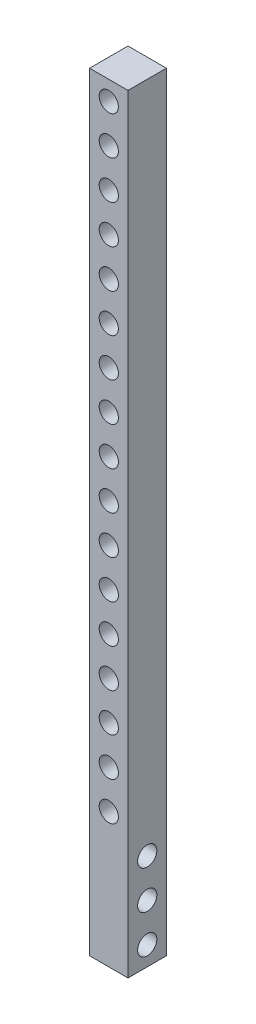
ISO-10303-21;
HEADER;
FILE_DESCRIPTION(('STEP AP214'),'2;1');
FILE_NAME('part.step','',(''),(''),'','','');
FILE_SCHEMA(('AUTOMOTIVE_DESIGN { 1 0 10303 214 1 1 1 1 }'));
ENDSEC;
DATA;
#1=APPLICATION_CONTEXT('core data for automotive mechanical design processes');
#2=APPLICATION_PROTOCOL_DEFINITION('international standard','automotive_design',2000,#1);
#3=PRODUCT_CONTEXT('',#1,'mechanical');
#4=PRODUCT('Part','Part','',(#3));
#5=PRODUCT_RELATED_PRODUCT_CATEGORY('part','',(#4));
#6=PRODUCT_DEFINITION_FORMATION('','',#4);
#7=PRODUCT_DEFINITION_CONTEXT('part definition',#1,'design');
#8=PRODUCT_DEFINITION('design','',#6,#7);
#9=PRODUCT_DEFINITION_SHAPE('','',#8);
#10=(LENGTH_UNIT() NAMED_UNIT(*) SI_UNIT(.MILLI.,.METRE.));
#11=(NAMED_UNIT(*) PLANE_ANGLE_UNIT() SI_UNIT($,.RADIAN.));
#12=(NAMED_UNIT(*) SI_UNIT($,.STERADIAN.) SOLID_ANGLE_UNIT());
#13=UNCERTAINTY_MEASURE_WITH_UNIT(LENGTH_MEASURE(1.E-05),#10,'distance_accuracy_value','');
#14=(GEOMETRIC_REPRESENTATION_CONTEXT(3) GLOBAL_UNCERTAINTY_ASSIGNED_CONTEXT((#13)) GLOBAL_UNIT_ASSIGNED_CONTEXT((#10,
#11,#12)) REPRESENTATION_CONTEXT('',''));
#15=CARTESIAN_POINT('',(0.,0.,0.));
#16=DIRECTION('',(0.,0.,1.));
#17=DIRECTION('',(1.,0.,0.));
#18=AXIS2_PLACEMENT_3D('',#15,#16,#17);
#19=CARTESIAN_POINT('',(0.,0.,10.));
#20=DIRECTION('',(0.,0.,-1.));
#21=DIRECTION('',(-1.,0.,0.));
#22=AXIS2_PLACEMENT_3D('',#19,#20,#21);
#23=PLANE('',#22);
#24=CARTESIAN_POINT('',(1.5720339642174E-12,-55.,10.));
#25=DIRECTION('',(0.,0.,1.));
#26=DIRECTION('',(1.,0.,0.));
#27=AXIS2_PLACEMENT_3D('',#24,#25,#26);
#28=CIRCLE('',#27,2.5);
#29=CARTESIAN_POINT('',(2.50000000000157,-55.,10.));
#30=VERTEX_POINT('',#29);
#31=EDGE_CURVE('E199',#30,#30,#28,.T.);
#32=ORIENTED_EDGE('',*,*,#31,.F.);
#33=EDGE_LOOP('',(#32));
#34=FACE_BOUND('',#33,.T.);
#35=CARTESIAN_POINT('',(1.36254508388681E-12,-35.,10.));
#36=DIRECTION('',(0.,0.,1.));
#37=DIRECTION('',(1.,0.,0.));
#38=AXIS2_PLACEMENT_3D('',#35,#36,#37);
#39=CIRCLE('',#38,2.5);
#40=CARTESIAN_POINT('',(2.50000000000136,-35.,10.));
#41=VERTEX_POINT('',#40);
#42=EDGE_CURVE('E187',#41,#41,#39,.T.);
#43=ORIENTED_EDGE('',*,*,#42,.F.);
#44=EDGE_LOOP('',(#43));
#45=FACE_BOUND('',#44,.T.);
#46=CARTESIAN_POINT('',(1.15305620355622E-12,-15.,10.));
#47=DIRECTION('',(0.,0.,1.));
#48=DIRECTION('',(1.,0.,0.));
#49=AXIS2_PLACEMENT_3D('',#46,#47,#48);
#50=CIRCLE('',#49,2.5);
#51=CARTESIAN_POINT('',(2.50000000000115,-15.,10.));
#52=VERTEX_POINT('',#51);
#53=EDGE_CURVE('E175',#52,#52,#50,.T.);
#54=ORIENTED_EDGE('',*,*,#53,.F.);
#55=EDGE_LOOP('',(#54));
#56=FACE_BOUND('',#55,.T.);
#57=CARTESIAN_POINT('',(9.43567323225634E-13,4.99999999999996,10.));
#58=DIRECTION('',(0.,0.,1.));
#59=DIRECTION('',(1.,0.,0.));
#60=AXIS2_PLACEMENT_3D('',#57,#58,#59);
#61=CIRCLE('',#60,2.5);
#62=CARTESIAN_POINT('',(2.50000000000094,4.99999999999996,10.));
#63=VERTEX_POINT('',#62);
#64=EDGE_CURVE('E163',#63,#63,#61,.T.);
#65=ORIENTED_EDGE('',*,*,#64,.F.);
#66=EDGE_LOOP('',(#65));
#67=FACE_BOUND('',#66,.T.);
#68=CARTESIAN_POINT('',(7.34078442895046E-13,25.,10.));
#69=DIRECTION('',(0.,0.,1.));
#70=DIRECTION('',(1.,0.,0.));
#71=AXIS2_PLACEMENT_3D('',#68,#69,#70);
#72=CIRCLE('',#71,2.5);
#73=CARTESIAN_POINT('',(2.50000000000073,25.,10.));
#74=VERTEX_POINT('',#73);
#75=EDGE_CURVE('E151',#74,#74,#72,.T.);
#76=ORIENTED_EDGE('',*,*,#75,.F.);
#77=EDGE_LOOP('',(#76));
#78=FACE_BOUND('',#77,.T.);
#79=CARTESIAN_POINT('',(5.24589562564458E-13,45.,10.));
#80=DIRECTION('',(0.,0.,1.));
#81=DIRECTION('',(1.,0.,0.));
#82=AXIS2_PLACEMENT_3D('',#79,#80,#81);
#83=CIRCLE('',#82,2.5);
#84=CARTESIAN_POINT('',(2.50000000000053,45.,10.));
#85=VERTEX_POINT('',#84);
#86=EDGE_CURVE('E139',#85,#85,#83,.T.);
#87=ORIENTED_EDGE('',*,*,#86,.F.);
#88=EDGE_LOOP('',(#87));
#89=FACE_BOUND('',#88,.T.);
#90=CARTESIAN_POINT('',(3.1510068223387E-13,65.,10.));
#91=DIRECTION('',(0.,0.,1.));
#92=DIRECTION('',(1.,0.,0.));
#93=AXIS2_PLACEMENT_3D('',#90,#91,#92);
#94=CIRCLE('',#93,2.5);
#95=CARTESIAN_POINT('',(2.50000000000032,65.,10.));
#96=VERTEX_POINT('',#95);
#97=EDGE_CURVE('E127',#96,#96,#94,.T.);
#98=ORIENTED_EDGE('',*,*,#97,.F.);
#99=EDGE_LOOP('',(#98));
#100=FACE_BOUND('',#99,.T.);
#101=CARTESIAN_POINT('',(1.05611801903282E-13,85.,10.));
#102=DIRECTION('',(0.,0.,1.));
#103=DIRECTION('',(1.,0.,0.));
#104=AXIS2_PLACEMENT_3D('',#101,#102,#103);
#105=CIRCLE('',#104,2.5);
#106=CARTESIAN_POINT('',(2.50000000000011,85.,10.));
#107=VERTEX_POINT('',#106);
#108=EDGE_CURVE('E115',#107,#107,#105,.T.);
#109=ORIENTED_EDGE('',*,*,#108,.F.);
#110=EDGE_LOOP('',(#109));
#111=FACE_BOUND('',#110,.T.);
#112=DIRECTION('',(0.,-1.,0.));
#113=VECTOR('',#112,1.);
#114=CARTESIAN_POINT('',(-5.00000000000001,100.,10.));
#115=LINE('',#114,#113);
#116=CARTESIAN_POINT('',(-5.00000000000001,100.,10.));
#117=VERTEX_POINT('',#116);
#118=CARTESIAN_POINT('',(-4.99999999999998,-100.,10.));
#119=VERTEX_POINT('',#118);
#120=EDGE_CURVE('E85',#117,#119,#115,.T.);
#121=ORIENTED_EDGE('',*,*,#120,.T.);
#122=DIRECTION('',(1.,0.,0.));
#123=VECTOR('',#122,1.);
#124=CARTESIAN_POINT('',(5.00000000000001,-100.,10.));
#125=LINE('',#124,#123);
#126=CARTESIAN_POINT('',(5.00000000000001,-100.,10.));
#127=VERTEX_POINT('',#126);
#128=EDGE_CURVE('E80',#119,#127,#125,.T.);
#129=ORIENTED_EDGE('',*,*,#128,.T.);
#130=DIRECTION('',(0.,1.,0.));
#131=VECTOR('',#130,1.);
#132=CARTESIAN_POINT('',(4.99999999999998,99.9999999999999,10.));
#133=LINE('',#132,#131);
#134=CARTESIAN_POINT('',(4.99999999999998,99.9999999999999,10.));
#135=VERTEX_POINT('',#134);
#136=EDGE_CURVE('E83',#127,#135,#133,.T.);
#137=ORIENTED_EDGE('',*,*,#136,.T.);
#138=DIRECTION('',(-1.,0.,0.));
#139=VECTOR('',#138,1.);
#140=CARTESIAN_POINT('',(4.99999999999998,99.9999999999999,10.));
#141=LINE('',#140,#139);
#142=EDGE_CURVE('E50',#135,#117,#141,.T.);
#143=ORIENTED_EDGE('',*,*,#142,.T.);
#144=EDGE_LOOP('',(#121,#129,#137,#143));
#145=FACE_BOUND('',#144,.T.);
#146=CARTESIAN_POINT('',(0.,95.,10.));
#147=DIRECTION('',(0.,0.,1.));
#148=DIRECTION('',(1.,0.,0.));
#149=AXIS2_PLACEMENT_3D('',#146,#147,#148);
#150=CIRCLE('',#149,2.5);
#151=CARTESIAN_POINT('',(2.5,95.,10.));
#152=VERTEX_POINT('',#151);
#153=EDGE_CURVE('E100',#152,#152,#150,.T.);
#154=ORIENTED_EDGE('',*,*,#153,.F.);
#155=EDGE_LOOP('',(#154));
#156=FACE_BOUND('',#155,.T.);
#157=CARTESIAN_POINT('',(2.10356242068576E-13,75.,10.));
#158=DIRECTION('',(0.,0.,1.));
#159=DIRECTION('',(1.,0.,0.));
#160=AXIS2_PLACEMENT_3D('',#157,#158,#159);
#161=CIRCLE('',#160,2.5);
#162=CARTESIAN_POINT('',(2.50000000000021,75.,10.));
#163=VERTEX_POINT('',#162);
#164=EDGE_CURVE('E121',#163,#163,#161,.T.);
#165=ORIENTED_EDGE('',*,*,#164,.F.);
#166=EDGE_LOOP('',(#165));
#167=FACE_BOUND('',#166,.T.);
#168=CARTESIAN_POINT('',(4.19845122399164E-13,55.,10.));
#169=DIRECTION('',(0.,0.,1.));
#170=DIRECTION('',(1.,0.,0.));
#171=AXIS2_PLACEMENT_3D('',#168,#169,#170);
#172=CIRCLE('',#171,2.5);
#173=CARTESIAN_POINT('',(2.50000000000042,55.,10.));
#174=VERTEX_POINT('',#173);
#175=EDGE_CURVE('E133',#174,#174,#172,.T.);
#176=ORIENTED_EDGE('',*,*,#175,.F.);
#177=EDGE_LOOP('',(#176));
#178=FACE_BOUND('',#177,.T.);
#179=CARTESIAN_POINT('',(6.29334002729752E-13,35.,10.));
#180=DIRECTION('',(0.,0.,1.));
#181=DIRECTION('',(1.,0.,0.));
#182=AXIS2_PLACEMENT_3D('',#179,#180,#181);
#183=CIRCLE('',#182,2.5);
#184=CARTESIAN_POINT('',(2.50000000000063,35.,10.));
#185=VERTEX_POINT('',#184);
#186=EDGE_CURVE('E145',#185,#185,#183,.T.);
#187=ORIENTED_EDGE('',*,*,#186,.F.);
#188=EDGE_LOOP('',(#187));
#189=FACE_BOUND('',#188,.T.);
#190=CARTESIAN_POINT('',(8.3882288306034E-13,15.,10.));
#191=DIRECTION('',(0.,0.,1.));
#192=DIRECTION('',(1.,0.,0.));
#193=AXIS2_PLACEMENT_3D('',#190,#191,#192);
#194=CIRCLE('',#193,2.5);
#195=CARTESIAN_POINT('',(2.50000000000084,15.,10.));
#196=VERTEX_POINT('',#195);
#197=EDGE_CURVE('E157',#196,#196,#194,.T.);
#198=ORIENTED_EDGE('',*,*,#197,.F.);
#199=EDGE_LOOP('',(#198));
#200=FACE_BOUND('',#199,.T.);
#201=CARTESIAN_POINT('',(1.04831176339093E-12,-5.00000000000005,10.));
#202=DIRECTION('',(0.,0.,1.));
#203=DIRECTION('',(1.,0.,0.));
#204=AXIS2_PLACEMENT_3D('',#201,#202,#203);
#205=CIRCLE('',#204,2.5);
#206=CARTESIAN_POINT('',(2.50000000000105,-5.00000000000005,10.));
#207=VERTEX_POINT('',#206);
#208=EDGE_CURVE('E169',#207,#207,#205,.T.);
#209=ORIENTED_EDGE('',*,*,#208,.F.);
#210=EDGE_LOOP('',(#209));
#211=FACE_BOUND('',#210,.T.);
#212=CARTESIAN_POINT('',(1.25780064372152E-12,-25.,10.));
#213=DIRECTION('',(0.,0.,1.));
#214=DIRECTION('',(1.,0.,0.));
#215=AXIS2_PLACEMENT_3D('',#212,#213,#214);
#216=CIRCLE('',#215,2.5);
#217=CARTESIAN_POINT('',(2.50000000000126,-25.,10.));
#218=VERTEX_POINT('',#217);
#219=EDGE_CURVE('E181',#218,#218,#216,.T.);
#220=ORIENTED_EDGE('',*,*,#219,.F.);
#221=EDGE_LOOP('',(#220));
#222=FACE_BOUND('',#221,.T.);
#223=CARTESIAN_POINT('',(1.4672895240521E-12,-45.0000000000001,10.));
#224=DIRECTION('',(0.,0.,1.));
#225=DIRECTION('',(1.,0.,0.));
#226=AXIS2_PLACEMENT_3D('',#223,#224,#225);
#227=CIRCLE('',#226,2.5);
#228=CARTESIAN_POINT('',(2.50000000000147,-45.0000000000001,10.));
#229=VERTEX_POINT('',#228);
#230=EDGE_CURVE('E193',#229,#229,#227,.T.);
#231=ORIENTED_EDGE('',*,*,#230,.F.);
#232=EDGE_LOOP('',(#231));
#233=FACE_BOUND('',#232,.T.);
#234=CARTESIAN_POINT('',(1.67677840438269E-12,-65.,10.));
#235=DIRECTION('',(0.,0.,1.));
#236=DIRECTION('',(1.,0.,0.));
#237=AXIS2_PLACEMENT_3D('',#234,#235,#236);
#238=CIRCLE('',#237,2.5);
#239=CARTESIAN_POINT('',(2.50000000000168,-65.,10.));
#240=VERTEX_POINT('',#239);
#241=EDGE_CURVE('E205',#240,#240,#238,.T.);
#242=ORIENTED_EDGE('',*,*,#241,.F.);
#243=EDGE_LOOP('',(#242));
#244=FACE_BOUND('',#243,.T.);
#245=ADVANCED_FACE('F33',(#34,#45,#56,#67,#78,#89,#100,#111,#145,#156,#167,#178,#189,#200,#211,
#222,#233,#244),#23,.F.);
#246=CARTESIAN_POINT('',(0.,0.,0.));
#247=DIRECTION('',(0.,0.,-1.));
#248=DIRECTION('',(-1.,0.,0.));
#249=AXIS2_PLACEMENT_3D('',#246,#247,#248);
#250=PLANE('',#249);
#251=CARTESIAN_POINT('',(1.5720339642174E-12,-55.,0.));
#252=DIRECTION('',(0.,0.,1.));
#253=DIRECTION('',(1.,0.,0.));
#254=AXIS2_PLACEMENT_3D('',#251,#252,#253);
#255=CIRCLE('',#254,2.5);
#256=CARTESIAN_POINT('',(2.50000000000157,-55.,0.));
#257=VERTEX_POINT('',#256);
#258=EDGE_CURVE('E202',#257,#257,#255,.T.);
#259=ORIENTED_EDGE('',*,*,#258,.T.);
#260=EDGE_LOOP('',(#259));
#261=FACE_BOUND('',#260,.T.);
#262=CARTESIAN_POINT('',(1.36254508388681E-12,-35.,0.));
#263=DIRECTION('',(0.,0.,1.));
#264=DIRECTION('',(1.,0.,0.));
#265=AXIS2_PLACEMENT_3D('',#262,#263,#264);
#266=CIRCLE('',#265,2.5);
#267=CARTESIAN_POINT('',(2.50000000000136,-35.,0.));
#268=VERTEX_POINT('',#267);
#269=EDGE_CURVE('E190',#268,#268,#266,.T.);
#270=ORIENTED_EDGE('',*,*,#269,.T.);
#271=EDGE_LOOP('',(#270));
#272=FACE_BOUND('',#271,.T.);
#273=CARTESIAN_POINT('',(1.15305620355622E-12,-15.,0.));
#274=DIRECTION('',(0.,0.,1.));
#275=DIRECTION('',(1.,0.,0.));
#276=AXIS2_PLACEMENT_3D('',#273,#274,#275);
#277=CIRCLE('',#276,2.5);
#278=CARTESIAN_POINT('',(2.50000000000115,-15.,0.));
#279=VERTEX_POINT('',#278);
#280=EDGE_CURVE('E178',#279,#279,#277,.T.);
#281=ORIENTED_EDGE('',*,*,#280,.T.);
#282=EDGE_LOOP('',(#281));
#283=FACE_BOUND('',#282,.T.);
#284=CARTESIAN_POINT('',(9.43567323225634E-13,4.99999999999996,0.));
#285=DIRECTION('',(0.,0.,1.));
#286=DIRECTION('',(1.,0.,0.));
#287=AXIS2_PLACEMENT_3D('',#284,#285,#286);
#288=CIRCLE('',#287,2.5);
#289=CARTESIAN_POINT('',(2.50000000000094,4.99999999999996,0.));
#290=VERTEX_POINT('',#289);
#291=EDGE_CURVE('E166',#290,#290,#288,.T.);
#292=ORIENTED_EDGE('',*,*,#291,.T.);
#293=EDGE_LOOP('',(#292));
#294=FACE_BOUND('',#293,.T.);
#295=CARTESIAN_POINT('',(7.34078442895046E-13,25.,0.));
#296=DIRECTION('',(0.,0.,1.));
#297=DIRECTION('',(1.,0.,0.));
#298=AXIS2_PLACEMENT_3D('',#295,#296,#297);
#299=CIRCLE('',#298,2.5);
#300=CARTESIAN_POINT('',(2.50000000000073,25.,0.));
#301=VERTEX_POINT('',#300);
#302=EDGE_CURVE('E154',#301,#301,#299,.T.);
#303=ORIENTED_EDGE('',*,*,#302,.T.);
#304=EDGE_LOOP('',(#303));
#305=FACE_BOUND('',#304,.T.);
#306=CARTESIAN_POINT('',(5.24589562564458E-13,45.,0.));
#307=DIRECTION('',(0.,0.,1.));
#308=DIRECTION('',(1.,0.,0.));
#309=AXIS2_PLACEMENT_3D('',#306,#307,#308);
#310=CIRCLE('',#309,2.5);
#311=CARTESIAN_POINT('',(2.50000000000053,45.,0.));
#312=VERTEX_POINT('',#311);
#313=EDGE_CURVE('E142',#312,#312,#310,.T.);
#314=ORIENTED_EDGE('',*,*,#313,.T.);
#315=EDGE_LOOP('',(#314));
#316=FACE_BOUND('',#315,.T.);
#317=CARTESIAN_POINT('',(3.1510068223387E-13,65.,0.));
#318=DIRECTION('',(0.,0.,1.));
#319=DIRECTION('',(1.,0.,0.));
#320=AXIS2_PLACEMENT_3D('',#317,#318,#319);
#321=CIRCLE('',#320,2.5);
#322=CARTESIAN_POINT('',(2.50000000000032,65.,0.));
#323=VERTEX_POINT('',#322);
#324=EDGE_CURVE('E130',#323,#323,#321,.T.);
#325=ORIENTED_EDGE('',*,*,#324,.T.);
#326=EDGE_LOOP('',(#325));
#327=FACE_BOUND('',#326,.T.);
#328=CARTESIAN_POINT('',(1.05611801903282E-13,85.,0.));
#329=DIRECTION('',(0.,0.,1.));
#330=DIRECTION('',(1.,0.,0.));
#331=AXIS2_PLACEMENT_3D('',#328,#329,#330);
#332=CIRCLE('',#331,2.5);
#333=CARTESIAN_POINT('',(2.50000000000011,85.,0.));
#334=VERTEX_POINT('',#333);
#335=EDGE_CURVE('E118',#334,#334,#332,.T.);
#336=ORIENTED_EDGE('',*,*,#335,.T.);
#337=EDGE_LOOP('',(#336));
#338=FACE_BOUND('',#337,.T.);
#339=DIRECTION('',(0.,-1.,0.));
#340=VECTOR('',#339,1.);
#341=CARTESIAN_POINT('',(-5.00000000000001,100.,0.));
#342=LINE('',#341,#340);
#343=CARTESIAN_POINT('',(-5.00000000000001,100.,0.));
#344=VERTEX_POINT('',#343);
#345=CARTESIAN_POINT('',(-4.99999999999998,-100.,0.));
#346=VERTEX_POINT('',#345);
#347=EDGE_CURVE('E97',#344,#346,#342,.T.);
#348=ORIENTED_EDGE('',*,*,#347,.F.);
#349=DIRECTION('',(-1.,0.,0.));
#350=VECTOR('',#349,1.);
#351=CARTESIAN_POINT('',(4.99999999999998,99.9999999999999,0.));
#352=LINE('',#351,#350);
#353=CARTESIAN_POINT('',(4.99999999999998,99.9999999999999,0.));
#354=VERTEX_POINT('',#353);
#355=EDGE_CURVE('E73',#354,#344,#352,.T.);
#356=ORIENTED_EDGE('',*,*,#355,.F.);
#357=DIRECTION('',(0.,1.,0.));
#358=VECTOR('',#357,1.);
#359=CARTESIAN_POINT('',(4.99999999999998,99.9999999999999,0.));
#360=LINE('',#359,#358);
#361=CARTESIAN_POINT('',(5.00000000000001,-100.,0.));
#362=VERTEX_POINT('',#361);
#363=EDGE_CURVE('E67',#362,#354,#360,.T.);
#364=ORIENTED_EDGE('',*,*,#363,.F.);
#365=DIRECTION('',(1.,0.,0.));
#366=VECTOR('',#365,1.);
#367=CARTESIAN_POINT('',(5.00000000000001,-100.,0.));
#368=LINE('',#367,#366);
#369=EDGE_CURVE('E89',#346,#362,#368,.T.);
#370=ORIENTED_EDGE('',*,*,#369,.F.);
#371=EDGE_LOOP('',(#348,#356,#364,#370));
#372=FACE_BOUND('',#371,.T.);
#373=CARTESIAN_POINT('',(0.,95.,0.));
#374=DIRECTION('',(0.,0.,1.));
#375=DIRECTION('',(1.,0.,0.));
#376=AXIS2_PLACEMENT_3D('',#373,#374,#375);
#377=CIRCLE('',#376,2.5);
#378=CARTESIAN_POINT('',(2.5,95.,0.));
#379=VERTEX_POINT('',#378);
#380=EDGE_CURVE('E112',#379,#379,#377,.T.);
#381=ORIENTED_EDGE('',*,*,#380,.T.);
#382=EDGE_LOOP('',(#381));
#383=FACE_BOUND('',#382,.T.);
#384=CARTESIAN_POINT('',(2.10356242068576E-13,75.,0.));
#385=DIRECTION('',(0.,0.,1.));
#386=DIRECTION('',(1.,0.,0.));
#387=AXIS2_PLACEMENT_3D('',#384,#385,#386);
#388=CIRCLE('',#387,2.5);
#389=CARTESIAN_POINT('',(2.50000000000021,75.,0.));
#390=VERTEX_POINT('',#389);
#391=EDGE_CURVE('E124',#390,#390,#388,.T.);
#392=ORIENTED_EDGE('',*,*,#391,.T.);
#393=EDGE_LOOP('',(#392));
#394=FACE_BOUND('',#393,.T.);
#395=CARTESIAN_POINT('',(4.19845122399164E-13,55.,0.));
#396=DIRECTION('',(0.,0.,1.));
#397=DIRECTION('',(1.,0.,0.));
#398=AXIS2_PLACEMENT_3D('',#395,#396,#397);
#399=CIRCLE('',#398,2.5);
#400=CARTESIAN_POINT('',(2.50000000000042,55.,0.));
#401=VERTEX_POINT('',#400);
#402=EDGE_CURVE('E136',#401,#401,#399,.T.);
#403=ORIENTED_EDGE('',*,*,#402,.T.);
#404=EDGE_LOOP('',(#403));
#405=FACE_BOUND('',#404,.T.);
#406=CARTESIAN_POINT('',(6.29334002729752E-13,35.,0.));
#407=DIRECTION('',(0.,0.,1.));
#408=DIRECTION('',(1.,0.,0.));
#409=AXIS2_PLACEMENT_3D('',#406,#407,#408);
#410=CIRCLE('',#409,2.5);
#411=CARTESIAN_POINT('',(2.50000000000063,35.,0.));
#412=VERTEX_POINT('',#411);
#413=EDGE_CURVE('E148',#412,#412,#410,.T.);
#414=ORIENTED_EDGE('',*,*,#413,.T.);
#415=EDGE_LOOP('',(#414));
#416=FACE_BOUND('',#415,.T.);
#417=CARTESIAN_POINT('',(8.3882288306034E-13,15.,0.));
#418=DIRECTION('',(0.,0.,1.));
#419=DIRECTION('',(1.,0.,0.));
#420=AXIS2_PLACEMENT_3D('',#417,#418,#419);
#421=CIRCLE('',#420,2.5);
#422=CARTESIAN_POINT('',(2.50000000000084,15.,0.));
#423=VERTEX_POINT('',#422);
#424=EDGE_CURVE('E160',#423,#423,#421,.T.);
#425=ORIENTED_EDGE('',*,*,#424,.T.);
#426=EDGE_LOOP('',(#425));
#427=FACE_BOUND('',#426,.T.);
#428=CARTESIAN_POINT('',(1.04831176339093E-12,-5.00000000000005,0.));
#429=DIRECTION('',(0.,0.,1.));
#430=DIRECTION('',(1.,0.,0.));
#431=AXIS2_PLACEMENT_3D('',#428,#429,#430);
#432=CIRCLE('',#431,2.5);
#433=CARTESIAN_POINT('',(2.50000000000105,-5.00000000000005,0.));
#434=VERTEX_POINT('',#433);
#435=EDGE_CURVE('E172',#434,#434,#432,.T.);
#436=ORIENTED_EDGE('',*,*,#435,.T.);
#437=EDGE_LOOP('',(#436));
#438=FACE_BOUND('',#437,.T.);
#439=CARTESIAN_POINT('',(1.25780064372152E-12,-25.,0.));
#440=DIRECTION('',(0.,0.,1.));
#441=DIRECTION('',(1.,0.,0.));
#442=AXIS2_PLACEMENT_3D('',#439,#440,#441);
#443=CIRCLE('',#442,2.5);
#444=CARTESIAN_POINT('',(2.50000000000126,-25.,0.));
#445=VERTEX_POINT('',#444);
#446=EDGE_CURVE('E184',#445,#445,#443,.T.);
#447=ORIENTED_EDGE('',*,*,#446,.T.);
#448=EDGE_LOOP('',(#447));
#449=FACE_BOUND('',#448,.T.);
#450=CARTESIAN_POINT('',(1.4672895240521E-12,-45.0000000000001,0.));
#451=DIRECTION('',(0.,0.,1.));
#452=DIRECTION('',(1.,0.,0.));
#453=AXIS2_PLACEMENT_3D('',#450,#451,#452);
#454=CIRCLE('',#453,2.5);
#455=CARTESIAN_POINT('',(2.50000000000147,-45.0000000000001,0.));
#456=VERTEX_POINT('',#455);
#457=EDGE_CURVE('E196',#456,#456,#454,.T.);
#458=ORIENTED_EDGE('',*,*,#457,.T.);
#459=EDGE_LOOP('',(#458));
#460=FACE_BOUND('',#459,.T.);
#461=CARTESIAN_POINT('',(1.67677840438269E-12,-65.,0.));
#462=DIRECTION('',(0.,0.,1.));
#463=DIRECTION('',(1.,0.,0.));
#464=AXIS2_PLACEMENT_3D('',#461,#462,#463);
#465=CIRCLE('',#464,2.5);
#466=CARTESIAN_POINT('',(2.50000000000168,-65.,0.));
#467=VERTEX_POINT('',#466);
#468=EDGE_CURVE('E208',#467,#467,#465,.T.);
#469=ORIENTED_EDGE('',*,*,#468,.T.);
#470=EDGE_LOOP('',(#469));
#471=FACE_BOUND('',#470,.T.);
#472=ADVANCED_FACE('F108',(#261,#272,#283,#294,#305,#316,#327,#338,#372,#383,#394,#405,#416,
#427,#438,#449,#460,#471),#250,.T.);
#473=CARTESIAN_POINT('',(-5.00000000000001,100.,10.));
#474=DIRECTION('',(1.,0.,0.));
#475=DIRECTION('',(0.,1.,0.));
#476=AXIS2_PLACEMENT_3D('',#473,#474,#475);
#477=PLANE('',#476);
#478=CARTESIAN_POINT('',(-4.99999999999999,-75.0000000000001,5.));
#479=DIRECTION('',(-1.,0.,0.));
#480=DIRECTION('',(0.,-1.,0.));
#481=AXIS2_PLACEMENT_3D('',#478,#479,#480);
#482=CIRCLE('',#481,2.5);
#483=CARTESIAN_POINT('',(-4.99999999999999,-77.5000000000001,5.));
#484=VERTEX_POINT('',#483);
#485=EDGE_CURVE('E226',#484,#484,#482,.T.);
#486=ORIENTED_EDGE('',*,*,#485,.F.);
#487=EDGE_LOOP('',(#486));
#488=FACE_BOUND('',#487,.T.);
#489=CARTESIAN_POINT('',(-4.99999999999999,-85.,5.));
#490=DIRECTION('',(-1.,0.,0.));
#491=DIRECTION('',(0.,-1.,0.));
#492=AXIS2_PLACEMENT_3D('',#489,#490,#491);
#493=CIRCLE('',#492,2.5);
#494=CARTESIAN_POINT('',(-4.99999999999999,-87.5000000000001,5.));
#495=VERTEX_POINT('',#494);
#496=EDGE_CURVE('E220',#495,#495,#493,.T.);
#497=ORIENTED_EDGE('',*,*,#496,.F.);
#498=EDGE_LOOP('',(#497));
#499=FACE_BOUND('',#498,.T.);
#500=CARTESIAN_POINT('',(-4.99999999999998,-95.,5.));
#501=DIRECTION('',(-1.,0.,0.));
#502=DIRECTION('',(0.,-1.,0.));
#503=AXIS2_PLACEMENT_3D('',#500,#501,#502);
#504=CIRCLE('',#503,2.5);
#505=CARTESIAN_POINT('',(-4.99999999999998,-97.5,5.));
#506=VERTEX_POINT('',#505);
#507=EDGE_CURVE('E214',#506,#506,#504,.T.);
#508=ORIENTED_EDGE('',*,*,#507,.F.);
#509=EDGE_LOOP('',(#508));
#510=FACE_BOUND('',#509,.T.);
#511=ORIENTED_EDGE('',*,*,#347,.T.);
#512=DIRECTION('',(0.,0.,-1.));
#513=VECTOR('',#512,1.);
#514=CARTESIAN_POINT('',(-4.99999999999998,-100.,10.));
#515=LINE('',#514,#513);
#516=EDGE_CURVE('E11',#119,#346,#515,.T.);
#517=ORIENTED_EDGE('',*,*,#516,.F.);
#518=ORIENTED_EDGE('',*,*,#120,.F.);
#519=DIRECTION('',(0.,0.,-1.));
#520=VECTOR('',#519,1.);
#521=CARTESIAN_POINT('',(-5.00000000000001,100.,10.));
#522=LINE('',#521,#520);
#523=EDGE_CURVE('E93',#117,#344,#522,.T.);
#524=ORIENTED_EDGE('',*,*,#523,.T.);
#525=EDGE_LOOP('',(#511,#517,#518,#524));
#526=FACE_BOUND('',#525,.T.);
#527=ADVANCED_FACE('F35',(#488,#499,#510,#526),#477,.F.);
#528=CARTESIAN_POINT('',(5.00000000000001,-100.,10.));
#529=DIRECTION('',(0.,1.,0.));
#530=DIRECTION('',(-1.,0.,0.));
#531=AXIS2_PLACEMENT_3D('',#528,#529,#530);
#532=PLANE('',#531);
#533=ORIENTED_EDGE('',*,*,#369,.T.);
#534=DIRECTION('',(0.,0.,-1.));
#535=VECTOR('',#534,1.);
#536=CARTESIAN_POINT('',(5.00000000000001,-100.,10.));
#537=LINE('',#536,#535);
#538=EDGE_CURVE('E42',#127,#362,#537,.T.);
#539=ORIENTED_EDGE('',*,*,#538,.F.);
#540=ORIENTED_EDGE('',*,*,#128,.F.);
#541=ORIENTED_EDGE('',*,*,#516,.T.);
#542=EDGE_LOOP('',(#533,#539,#540,#541));
#543=FACE_BOUND('',#542,.T.);
#544=ADVANCED_FACE('F88',(#543),#532,.F.);
#545=CARTESIAN_POINT('',(4.99999999999998,99.9999999999999,10.));
#546=DIRECTION('',(-1.,0.,0.));
#547=DIRECTION('',(0.,-1.,0.));
#548=AXIS2_PLACEMENT_3D('',#545,#546,#547);
#549=PLANE('',#548);
#550=CARTESIAN_POINT('',(5.00000000000004,-75.0000000000001,5.));
#551=DIRECTION('',(-1.,0.,0.));
#552=DIRECTION('',(0.,-1.,0.));
#553=AXIS2_PLACEMENT_3D('',#550,#551,#552);
#554=CIRCLE('',#553,2.5);
#555=CARTESIAN_POINT('',(5.00000000000004,-77.5000000000001,5.));
#556=VERTEX_POINT('',#555);
#557=EDGE_CURVE('E223',#556,#556,#554,.T.);
#558=ORIENTED_EDGE('',*,*,#557,.T.);
#559=EDGE_LOOP('',(#558));
#560=FACE_BOUND('',#559,.T.);
#561=CARTESIAN_POINT('',(5.00000000000004,-85.,5.));
#562=DIRECTION('',(-1.,0.,0.));
#563=DIRECTION('',(0.,-1.,0.));
#564=AXIS2_PLACEMENT_3D('',#561,#562,#563);
#565=CIRCLE('',#564,2.5);
#566=CARTESIAN_POINT('',(5.00000000000004,-87.5000000000001,5.));
#567=VERTEX_POINT('',#566);
#568=EDGE_CURVE('E217',#567,#567,#565,.T.);
#569=ORIENTED_EDGE('',*,*,#568,.T.);
#570=EDGE_LOOP('',(#569));
#571=FACE_BOUND('',#570,.T.);
#572=CARTESIAN_POINT('',(5.00000000000004,-95.,5.));
#573=DIRECTION('',(-1.,0.,0.));
#574=DIRECTION('',(0.,-1.,0.));
#575=AXIS2_PLACEMENT_3D('',#572,#573,#574);
#576=CIRCLE('',#575,2.5);
#577=CARTESIAN_POINT('',(5.00000000000004,-97.5,5.));
#578=VERTEX_POINT('',#577);
#579=EDGE_CURVE('E211',#578,#578,#576,.T.);
#580=ORIENTED_EDGE('',*,*,#579,.T.);
#581=EDGE_LOOP('',(#580));
#582=FACE_BOUND('',#581,.T.);
#583=ORIENTED_EDGE('',*,*,#363,.T.);
#584=DIRECTION('',(0.,0.,-1.));
#585=VECTOR('',#584,1.);
#586=CARTESIAN_POINT('',(4.99999999999998,99.9999999999999,10.));
#587=LINE('',#586,#585);
#588=EDGE_CURVE('E90',#135,#354,#587,.T.);
#589=ORIENTED_EDGE('',*,*,#588,.F.);
#590=ORIENTED_EDGE('',*,*,#136,.F.);
#591=ORIENTED_EDGE('',*,*,#538,.T.);
#592=EDGE_LOOP('',(#583,#589,#590,#591));
#593=FACE_BOUND('',#592,.T.);
#594=ADVANCED_FACE('F91',(#560,#571,#582,#593),#549,.F.);
#595=CARTESIAN_POINT('',(4.99999999999998,99.9999999999999,10.));
#596=DIRECTION('',(0.,-1.,0.));
#597=DIRECTION('',(1.,0.,0.));
#598=AXIS2_PLACEMENT_3D('',#595,#596,#597);
#599=PLANE('',#598);
#600=ORIENTED_EDGE('',*,*,#355,.T.);
#601=ORIENTED_EDGE('',*,*,#523,.F.);
#602=ORIENTED_EDGE('',*,*,#142,.F.);
#603=ORIENTED_EDGE('',*,*,#588,.T.);
#604=EDGE_LOOP('',(#600,#601,#602,#603));
#605=FACE_BOUND('',#604,.T.);
#606=ADVANCED_FACE('F105',(#605),#599,.F.);
#607=CARTESIAN_POINT('',(0.,95.,10.));
#608=DIRECTION('',(0.,0.,-1.));
#609=DIRECTION('',(-1.,0.,0.));
#610=AXIS2_PLACEMENT_3D('',#607,#608,#609);
#611=CYLINDRICAL_SURFACE('',#610,2.5);
#612=ORIENTED_EDGE('',*,*,#153,.T.);
#613=EDGE_LOOP('',(#612));
#614=FACE_BOUND('',#613,.T.);
#615=ORIENTED_EDGE('',*,*,#380,.F.);
#616=EDGE_LOOP('',(#615));
#617=FACE_BOUND('',#616,.T.);
#618=ADVANCED_FACE('F273',(#614,#617),#611,.F.);
#619=CARTESIAN_POINT('',(1.05611801903282E-13,85.,10.));
#620=DIRECTION('',(0.,0.,-1.));
#621=DIRECTION('',(-1.,0.,0.));
#622=AXIS2_PLACEMENT_3D('',#619,#620,#621);
#623=CYLINDRICAL_SURFACE('',#622,2.5);
#624=ORIENTED_EDGE('',*,*,#108,.T.);
#625=EDGE_LOOP('',(#624));
#626=FACE_BOUND('',#625,.T.);
#627=ORIENTED_EDGE('',*,*,#335,.F.);
#628=EDGE_LOOP('',(#627));
#629=FACE_BOUND('',#628,.T.);
#630=ADVANCED_FACE('F299',(#626,#629),#623,.F.);
#631=CARTESIAN_POINT('',(2.10356242068576E-13,75.,10.));
#632=DIRECTION('',(0.,0.,-1.));
#633=DIRECTION('',(-1.,0.,0.));
#634=AXIS2_PLACEMENT_3D('',#631,#632,#633);
#635=CYLINDRICAL_SURFACE('',#634,2.5);
#636=ORIENTED_EDGE('',*,*,#164,.T.);
#637=EDGE_LOOP('',(#636));
#638=FACE_BOUND('',#637,.T.);
#639=ORIENTED_EDGE('',*,*,#391,.F.);
#640=EDGE_LOOP('',(#639));
#641=FACE_BOUND('',#640,.T.);
#642=ADVANCED_FACE('F306',(#638,#641),#635,.F.);
#643=CARTESIAN_POINT('',(3.1510068223387E-13,65.,10.));
#644=DIRECTION('',(0.,0.,-1.));
#645=DIRECTION('',(-1.,0.,0.));
#646=AXIS2_PLACEMENT_3D('',#643,#644,#645);
#647=CYLINDRICAL_SURFACE('',#646,2.5);
#648=ORIENTED_EDGE('',*,*,#97,.T.);
#649=EDGE_LOOP('',(#648));
#650=FACE_BOUND('',#649,.T.);
#651=ORIENTED_EDGE('',*,*,#324,.F.);
#652=EDGE_LOOP('',(#651));
#653=FACE_BOUND('',#652,.T.);
#654=ADVANCED_FACE('F313',(#650,#653),#647,.F.);
#655=CARTESIAN_POINT('',(4.19845122399164E-13,55.,10.));
#656=DIRECTION('',(0.,0.,-1.));
#657=DIRECTION('',(-1.,0.,0.));
#658=AXIS2_PLACEMENT_3D('',#655,#656,#657);
#659=CYLINDRICAL_SURFACE('',#658,2.5);
#660=ORIENTED_EDGE('',*,*,#175,.T.);
#661=EDGE_LOOP('',(#660));
#662=FACE_BOUND('',#661,.T.);
#663=ORIENTED_EDGE('',*,*,#402,.F.);
#664=EDGE_LOOP('',(#663));
#665=FACE_BOUND('',#664,.T.);
#666=ADVANCED_FACE('F321',(#662,#665),#659,.F.);
#667=CARTESIAN_POINT('',(5.24589562564458E-13,45.,10.));
#668=DIRECTION('',(0.,0.,-1.));
#669=DIRECTION('',(-1.,0.,0.));
#670=AXIS2_PLACEMENT_3D('',#667,#668,#669);
#671=CYLINDRICAL_SURFACE('',#670,2.5);
#672=ORIENTED_EDGE('',*,*,#86,.T.);
#673=EDGE_LOOP('',(#672));
#674=FACE_BOUND('',#673,.T.);
#675=ORIENTED_EDGE('',*,*,#313,.F.);
#676=EDGE_LOOP('',(#675));
#677=FACE_BOUND('',#676,.T.);
#678=ADVANCED_FACE('F329',(#674,#677),#671,.F.);
#679=CARTESIAN_POINT('',(6.29334002729752E-13,35.,10.));
#680=DIRECTION('',(0.,0.,-1.));
#681=DIRECTION('',(-1.,0.,0.));
#682=AXIS2_PLACEMENT_3D('',#679,#680,#681);
#683=CYLINDRICAL_SURFACE('',#682,2.5);
#684=ORIENTED_EDGE('',*,*,#186,.T.);
#685=EDGE_LOOP('',(#684));
#686=FACE_BOUND('',#685,.T.);
#687=ORIENTED_EDGE('',*,*,#413,.F.);
#688=EDGE_LOOP('',(#687));
#689=FACE_BOUND('',#688,.T.);
#690=ADVANCED_FACE('F337',(#686,#689),#683,.F.);
#691=CARTESIAN_POINT('',(7.34078442895046E-13,25.,10.));
#692=DIRECTION('',(0.,0.,-1.));
#693=DIRECTION('',(-1.,0.,0.));
#694=AXIS2_PLACEMENT_3D('',#691,#692,#693);
#695=CYLINDRICAL_SURFACE('',#694,2.5);
#696=ORIENTED_EDGE('',*,*,#75,.T.);
#697=EDGE_LOOP('',(#696));
#698=FACE_BOUND('',#697,.T.);
#699=ORIENTED_EDGE('',*,*,#302,.F.);
#700=EDGE_LOOP('',(#699));
#701=FACE_BOUND('',#700,.T.);
#702=ADVANCED_FACE('F345',(#698,#701),#695,.F.);
#703=CARTESIAN_POINT('',(8.3882288306034E-13,15.,10.));
#704=DIRECTION('',(0.,0.,-1.));
#705=DIRECTION('',(-1.,0.,0.));
#706=AXIS2_PLACEMENT_3D('',#703,#704,#705);
#707=CYLINDRICAL_SURFACE('',#706,2.5);
#708=ORIENTED_EDGE('',*,*,#197,.T.);
#709=EDGE_LOOP('',(#708));
#710=FACE_BOUND('',#709,.T.);
#711=ORIENTED_EDGE('',*,*,#424,.F.);
#712=EDGE_LOOP('',(#711));
#713=FACE_BOUND('',#712,.T.);
#714=ADVANCED_FACE('F353',(#710,#713),#707,.F.);
#715=CARTESIAN_POINT('',(9.43567323225634E-13,4.99999999999996,10.));
#716=DIRECTION('',(0.,0.,-1.));
#717=DIRECTION('',(-1.,0.,0.));
#718=AXIS2_PLACEMENT_3D('',#715,#716,#717);
#719=CYLINDRICAL_SURFACE('',#718,2.5);
#720=ORIENTED_EDGE('',*,*,#64,.T.);
#721=EDGE_LOOP('',(#720));
#722=FACE_BOUND('',#721,.T.);
#723=ORIENTED_EDGE('',*,*,#291,.F.);
#724=EDGE_LOOP('',(#723));
#725=FACE_BOUND('',#724,.T.);
#726=ADVANCED_FACE('F361',(#722,#725),#719,.F.);
#727=CARTESIAN_POINT('',(1.04831176339093E-12,-5.00000000000005,10.));
#728=DIRECTION('',(0.,0.,-1.));
#729=DIRECTION('',(-1.,0.,0.));
#730=AXIS2_PLACEMENT_3D('',#727,#728,#729);
#731=CYLINDRICAL_SURFACE('',#730,2.5);
#732=ORIENTED_EDGE('',*,*,#208,.T.);
#733=EDGE_LOOP('',(#732));
#734=FACE_BOUND('',#733,.T.);
#735=ORIENTED_EDGE('',*,*,#435,.F.);
#736=EDGE_LOOP('',(#735));
#737=FACE_BOUND('',#736,.T.);
#738=ADVANCED_FACE('F369',(#734,#737),#731,.F.);
#739=CARTESIAN_POINT('',(1.15305620355622E-12,-15.,10.));
#740=DIRECTION('',(0.,0.,-1.));
#741=DIRECTION('',(-1.,0.,0.));
#742=AXIS2_PLACEMENT_3D('',#739,#740,#741);
#743=CYLINDRICAL_SURFACE('',#742,2.5);
#744=ORIENTED_EDGE('',*,*,#53,.T.);
#745=EDGE_LOOP('',(#744));
#746=FACE_BOUND('',#745,.T.);
#747=ORIENTED_EDGE('',*,*,#280,.F.);
#748=EDGE_LOOP('',(#747));
#749=FACE_BOUND('',#748,.T.);
#750=ADVANCED_FACE('F377',(#746,#749),#743,.F.);
#751=CARTESIAN_POINT('',(1.25780064372152E-12,-25.,10.));
#752=DIRECTION('',(0.,0.,-1.));
#753=DIRECTION('',(-1.,0.,0.));
#754=AXIS2_PLACEMENT_3D('',#751,#752,#753);
#755=CYLINDRICAL_SURFACE('',#754,2.5);
#756=ORIENTED_EDGE('',*,*,#219,.T.);
#757=EDGE_LOOP('',(#756));
#758=FACE_BOUND('',#757,.T.);
#759=ORIENTED_EDGE('',*,*,#446,.F.);
#760=EDGE_LOOP('',(#759));
#761=FACE_BOUND('',#760,.T.);
#762=ADVANCED_FACE('F385',(#758,#761),#755,.F.);
#763=CARTESIAN_POINT('',(1.36254508388681E-12,-35.,10.));
#764=DIRECTION('',(0.,0.,-1.));
#765=DIRECTION('',(-1.,0.,0.));
#766=AXIS2_PLACEMENT_3D('',#763,#764,#765);
#767=CYLINDRICAL_SURFACE('',#766,2.5);
#768=ORIENTED_EDGE('',*,*,#42,.T.);
#769=EDGE_LOOP('',(#768));
#770=FACE_BOUND('',#769,.T.);
#771=ORIENTED_EDGE('',*,*,#269,.F.);
#772=EDGE_LOOP('',(#771));
#773=FACE_BOUND('',#772,.T.);
#774=ADVANCED_FACE('F393',(#770,#773),#767,.F.);
#775=CARTESIAN_POINT('',(1.4672895240521E-12,-45.0000000000001,10.));
#776=DIRECTION('',(0.,0.,-1.));
#777=DIRECTION('',(-1.,0.,0.));
#778=AXIS2_PLACEMENT_3D('',#775,#776,#777);
#779=CYLINDRICAL_SURFACE('',#778,2.5);
#780=ORIENTED_EDGE('',*,*,#230,.T.);
#781=EDGE_LOOP('',(#780));
#782=FACE_BOUND('',#781,.T.);
#783=ORIENTED_EDGE('',*,*,#457,.F.);
#784=EDGE_LOOP('',(#783));
#785=FACE_BOUND('',#784,.T.);
#786=ADVANCED_FACE('F401',(#782,#785),#779,.F.);
#787=CARTESIAN_POINT('',(1.5720339642174E-12,-55.,10.));
#788=DIRECTION('',(0.,0.,-1.));
#789=DIRECTION('',(-1.,0.,0.));
#790=AXIS2_PLACEMENT_3D('',#787,#788,#789);
#791=CYLINDRICAL_SURFACE('',#790,2.5);
#792=ORIENTED_EDGE('',*,*,#31,.T.);
#793=EDGE_LOOP('',(#792));
#794=FACE_BOUND('',#793,.T.);
#795=ORIENTED_EDGE('',*,*,#258,.F.);
#796=EDGE_LOOP('',(#795));
#797=FACE_BOUND('',#796,.T.);
#798=ADVANCED_FACE('F258',(#794,#797),#791,.F.);
#799=CARTESIAN_POINT('',(1.67677840438269E-12,-65.,10.));
#800=DIRECTION('',(0.,0.,-1.));
#801=DIRECTION('',(-1.,0.,0.));
#802=AXIS2_PLACEMENT_3D('',#799,#800,#801);
#803=CYLINDRICAL_SURFACE('',#802,2.5);
#804=ORIENTED_EDGE('',*,*,#241,.T.);
#805=EDGE_LOOP('',(#804));
#806=FACE_BOUND('',#805,.T.);
#807=ORIENTED_EDGE('',*,*,#468,.F.);
#808=EDGE_LOOP('',(#807));
#809=FACE_BOUND('',#808,.T.);
#810=ADVANCED_FACE('F249',(#806,#809),#803,.F.);
#811=CARTESIAN_POINT('',(5.00000000000004,-95.,5.));
#812=DIRECTION('',(-1.,0.,0.));
#813=DIRECTION('',(0.,-1.,0.));
#814=AXIS2_PLACEMENT_3D('',#811,#812,#813);
#815=CYLINDRICAL_SURFACE('',#814,2.5);
#816=ORIENTED_EDGE('',*,*,#579,.F.);
#817=EDGE_LOOP('',(#816));
#818=FACE_BOUND('',#817,.T.);
#819=ORIENTED_EDGE('',*,*,#507,.T.);
#820=EDGE_LOOP('',(#819));
#821=FACE_BOUND('',#820,.T.);
#822=ADVANCED_FACE('F247',(#818,#821),#815,.F.);
#823=CARTESIAN_POINT('',(5.00000000000004,-85.,5.));
#824=DIRECTION('',(-1.,0.,0.));
#825=DIRECTION('',(0.,-1.,0.));
#826=AXIS2_PLACEMENT_3D('',#823,#824,#825);
#827=CYLINDRICAL_SURFACE('',#826,2.5);
#828=ORIENTED_EDGE('',*,*,#568,.F.);
#829=EDGE_LOOP('',(#828));
#830=FACE_BOUND('',#829,.T.);
#831=ORIENTED_EDGE('',*,*,#496,.T.);
#832=EDGE_LOOP('',(#831));
#833=FACE_BOUND('',#832,.T.);
#834=ADVANCED_FACE('F237',(#830,#833),#827,.F.);
#835=CARTESIAN_POINT('',(5.00000000000004,-75.0000000000001,5.));
#836=DIRECTION('',(-1.,0.,0.));
#837=DIRECTION('',(0.,-1.,0.));
#838=AXIS2_PLACEMENT_3D('',#835,#836,#837);
#839=CYLINDRICAL_SURFACE('',#838,2.5);
#840=ORIENTED_EDGE('',*,*,#557,.F.);
#841=EDGE_LOOP('',(#840));
#842=FACE_BOUND('',#841,.T.);
#843=ORIENTED_EDGE('',*,*,#485,.T.);
#844=EDGE_LOOP('',(#843));
#845=FACE_BOUND('',#844,.T.);
#846=ADVANCED_FACE('F234',(#842,#845),#839,.F.);
#847=CLOSED_SHELL('',(#245,#472,#527,#544,#594,#606,#618,#630,#642,#654,#666,#678,#690,#702,
#714,#726,#738,#750,#762,#774,#786,#798,#810,#822,#834,#846));
#848=MANIFOLD_SOLID_BREP('B2',#847);
#849=ADVANCED_BREP_SHAPE_REPRESENTATION('',(#18,#848),#14);
#850=SHAPE_DEFINITION_REPRESENTATION(#9,#849);
ENDSEC;
END-ISO-10303-21;
